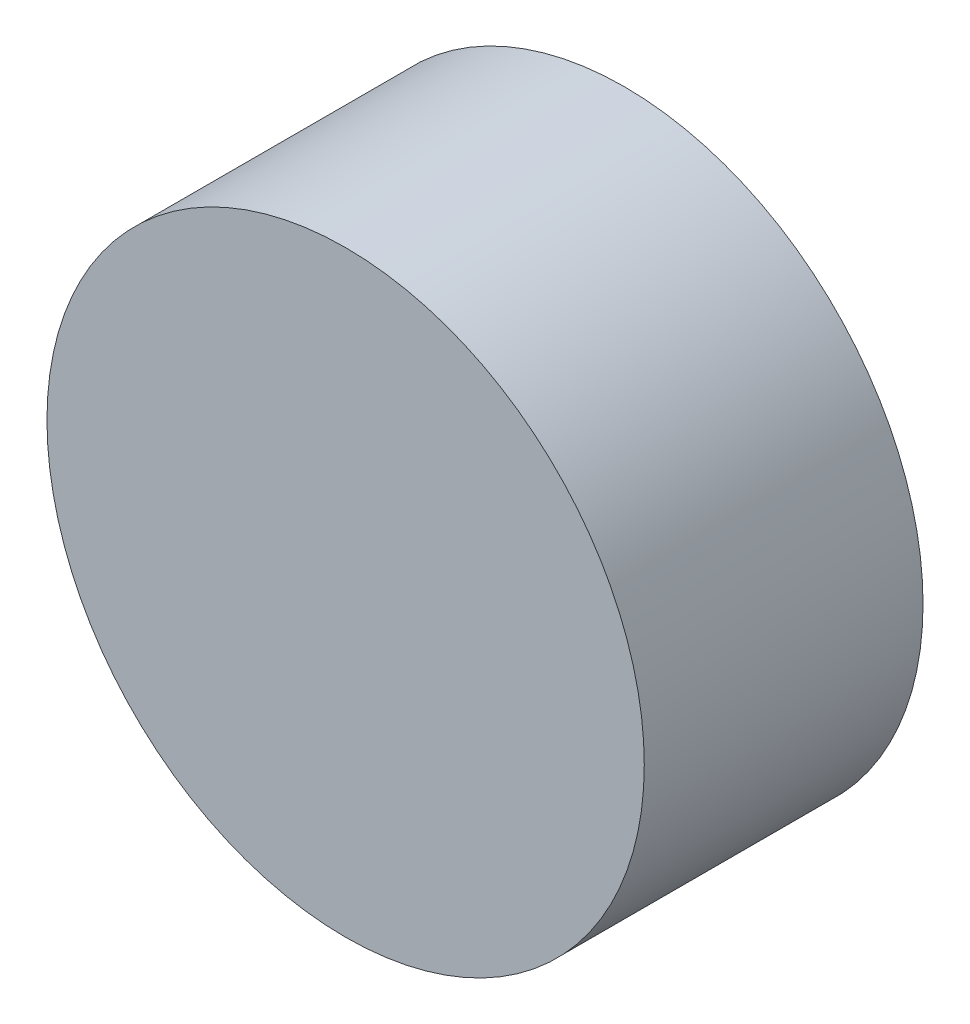
ISO-10303-21;
HEADER;
FILE_DESCRIPTION(('STEP AP214'),'2;1');
FILE_NAME('part.step','',(''),(''),'','','');
FILE_SCHEMA(('AUTOMOTIVE_DESIGN { 1 0 10303 214 1 1 1 1 }'));
ENDSEC;
DATA;
#1=APPLICATION_CONTEXT('core data for automotive mechanical design processes');
#2=APPLICATION_PROTOCOL_DEFINITION('international standard','automotive_design',2000,#1);
#3=PRODUCT_CONTEXT('',#1,'mechanical');
#4=PRODUCT('Part','Part','',(#3));
#5=PRODUCT_RELATED_PRODUCT_CATEGORY('part','',(#4));
#6=PRODUCT_DEFINITION_FORMATION('','',#4);
#7=PRODUCT_DEFINITION_CONTEXT('part definition',#1,'design');
#8=PRODUCT_DEFINITION('design','',#6,#7);
#9=PRODUCT_DEFINITION_SHAPE('','',#8);
#10=(LENGTH_UNIT() NAMED_UNIT(*) SI_UNIT(.MILLI.,.METRE.));
#11=(NAMED_UNIT(*) PLANE_ANGLE_UNIT() SI_UNIT($,.RADIAN.));
#12=(NAMED_UNIT(*) SI_UNIT($,.STERADIAN.) SOLID_ANGLE_UNIT());
#13=UNCERTAINTY_MEASURE_WITH_UNIT(LENGTH_MEASURE(1.E-05),#10,'distance_accuracy_value','');
#14=(GEOMETRIC_REPRESENTATION_CONTEXT(3) GLOBAL_UNCERTAINTY_ASSIGNED_CONTEXT((#13)) GLOBAL_UNIT_ASSIGNED_CONTEXT((#10,
#11,#12)) REPRESENTATION_CONTEXT('',''));
#15=CARTESIAN_POINT('',(0.,0.,0.));
#16=DIRECTION('',(0.,0.,1.));
#17=DIRECTION('',(1.,0.,0.));
#18=AXIS2_PLACEMENT_3D('',#15,#16,#17);
#19=CARTESIAN_POINT('',(0.,0.,28.));
#20=DIRECTION('',(0.,0.,-1.));
#21=DIRECTION('',(-1.,0.,0.));
#22=AXIS2_PLACEMENT_3D('',#19,#20,#21);
#23=CYLINDRICAL_SURFACE('',#22,60.);
#24=CARTESIAN_POINT('',(0.,0.,28.));
#25=DIRECTION('',(0.,0.,1.));
#26=DIRECTION('',(1.,0.,0.));
#27=AXIS2_PLACEMENT_3D('',#24,#25,#26);
#28=CIRCLE('',#27,60.);
#29=CARTESIAN_POINT('',(60.,0.,28.));
#30=VERTEX_POINT('',#29);
#31=EDGE_CURVE('E10',#30,#30,#28,.T.);
#32=ORIENTED_EDGE('',*,*,#31,.F.);
#33=EDGE_LOOP('',(#32));
#34=FACE_BOUND('',#33,.T.);
#35=CARTESIAN_POINT('',(0.,0.,-28.));
#36=DIRECTION('',(0.,0.,1.));
#37=DIRECTION('',(1.,0.,0.));
#38=AXIS2_PLACEMENT_3D('',#35,#36,#37);
#39=CIRCLE('',#38,60.);
#40=CARTESIAN_POINT('',(60.,0.,-28.));
#41=VERTEX_POINT('',#40);
#42=EDGE_CURVE('E36',#41,#41,#39,.T.);
#43=ORIENTED_EDGE('',*,*,#42,.T.);
#44=EDGE_LOOP('',(#43));
#45=FACE_BOUND('',#44,.T.);
#46=ADVANCED_FACE('F33',(#34,#45),#23,.T.);
#47=CARTESIAN_POINT('',(0.,0.,28.));
#48=DIRECTION('',(0.,0.,1.));
#49=DIRECTION('',(1.,0.,0.));
#50=AXIS2_PLACEMENT_3D('',#47,#48,#49);
#51=PLANE('',#50);
#52=ORIENTED_EDGE('',*,*,#31,.T.);
#53=EDGE_LOOP('',(#52));
#54=FACE_BOUND('',#53,.T.);
#55=ADVANCED_FACE('F48',(#54),#51,.T.);
#56=CARTESIAN_POINT('',(0.,0.,-28.));
#57=DIRECTION('',(0.,0.,1.));
#58=DIRECTION('',(1.,0.,0.));
#59=AXIS2_PLACEMENT_3D('',#56,#57,#58);
#60=PLANE('',#59);
#61=ORIENTED_EDGE('',*,*,#42,.F.);
#62=EDGE_LOOP('',(#61));
#63=FACE_BOUND('',#62,.T.);
#64=ADVANCED_FACE('F46',(#63),#60,.F.);
#65=CLOSED_SHELL('',(#46,#55,#64));
#66=MANIFOLD_SOLID_BREP('B2',#65);
#67=ADVANCED_BREP_SHAPE_REPRESENTATION('',(#18,#66),#14);
#68=SHAPE_DEFINITION_REPRESENTATION(#9,#67);
ENDSEC;
END-ISO-10303-21;
